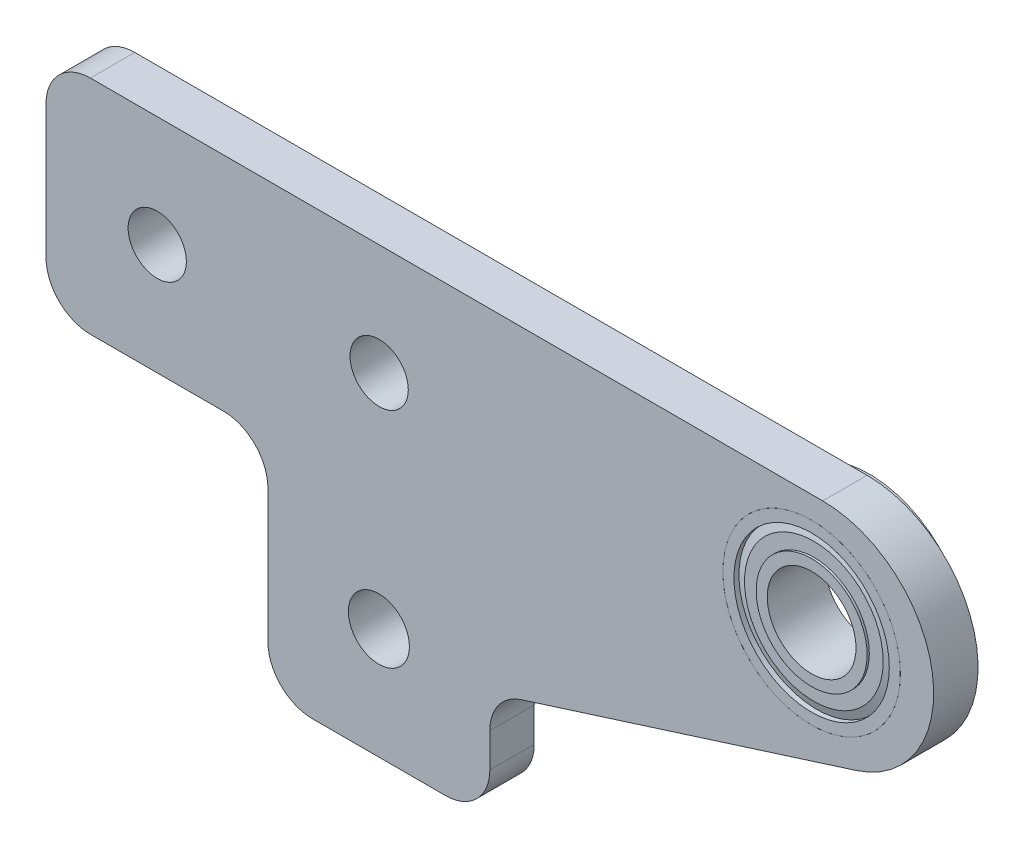
ISO-10303-21;
HEADER;
FILE_DESCRIPTION(('STEP AP214'),'2;1');
FILE_NAME('part.step','',(''),(''),'','','');
FILE_SCHEMA(('AUTOMOTIVE_DESIGN { 1 0 10303 214 1 1 1 1 }'));
ENDSEC;
DATA;
#1=APPLICATION_CONTEXT('core data for automotive mechanical design processes');
#2=APPLICATION_PROTOCOL_DEFINITION('international standard','automotive_design',2000,#1);
#3=PRODUCT_CONTEXT('',#1,'mechanical');
#4=PRODUCT('Part','Part','',(#3));
#5=PRODUCT_RELATED_PRODUCT_CATEGORY('part','',(#4));
#6=PRODUCT_DEFINITION_FORMATION('','',#4);
#7=PRODUCT_DEFINITION_CONTEXT('part definition',#1,'design');
#8=PRODUCT_DEFINITION('design','',#6,#7);
#9=PRODUCT_DEFINITION_SHAPE('','',#8);
#10=(LENGTH_UNIT() NAMED_UNIT(*) SI_UNIT(.MILLI.,.METRE.));
#11=(NAMED_UNIT(*) PLANE_ANGLE_UNIT() SI_UNIT($,.RADIAN.));
#12=(NAMED_UNIT(*) SI_UNIT($,.STERADIAN.) SOLID_ANGLE_UNIT());
#13=UNCERTAINTY_MEASURE_WITH_UNIT(LENGTH_MEASURE(1.E-05),#10,'distance_accuracy_value','');
#14=(GEOMETRIC_REPRESENTATION_CONTEXT(3) GLOBAL_UNCERTAINTY_ASSIGNED_CONTEXT((#13)) GLOBAL_UNIT_ASSIGNED_CONTEXT((#10,
#11,#12)) REPRESENTATION_CONTEXT('',''));
#15=CARTESIAN_POINT('',(0.,0.,0.));
#16=DIRECTION('',(0.,0.,1.));
#17=DIRECTION('',(1.,0.,0.));
#18=AXIS2_PLACEMENT_3D('',#15,#16,#17);
#19=CARTESIAN_POINT('',(0.,0.,-3.2));
#20=DIRECTION('',(0.,0.,1.));
#21=DIRECTION('',(1.,0.,0.));
#22=AXIS2_PLACEMENT_3D('',#19,#20,#21);
#23=CYLINDRICAL_SURFACE('',#22,9.);
#24=CARTESIAN_POINT('',(0.,0.,-3.2));
#25=DIRECTION('',(0.,0.,-1.));
#26=DIRECTION('',(-1.,0.,0.));
#27=AXIS2_PLACEMENT_3D('',#24,#25,#26);
#28=CIRCLE('',#27,9.);
#29=CARTESIAN_POINT('',(-9.,0.,-3.2));
#30=VERTEX_POINT('',#29);
#31=EDGE_CURVE('E51',#30,#30,#28,.T.);
#32=ORIENTED_EDGE('',*,*,#31,.F.);
#33=EDGE_LOOP('',(#32));
#34=FACE_BOUND('',#33,.T.);
#35=CARTESIAN_POINT('',(0.,0.,-2.));
#36=DIRECTION('',(0.,0.,-1.));
#37=DIRECTION('',(-1.,0.,0.));
#38=AXIS2_PLACEMENT_3D('',#35,#36,#37);
#39=CIRCLE('',#38,9.);
#40=CARTESIAN_POINT('',(-9.,0.,-2.));
#41=VERTEX_POINT('',#40);
#42=EDGE_CURVE('E47',#41,#41,#39,.T.);
#43=ORIENTED_EDGE('',*,*,#42,.T.);
#44=EDGE_LOOP('',(#43));
#45=FACE_BOUND('',#44,.T.);
#46=ADVANCED_FACE('F44',(#34,#45),#23,.T.);
#47=CARTESIAN_POINT('',(0.,0.,-3.2));
#48=DIRECTION('',(0.,0.,-1.));
#49=DIRECTION('',(-1.,0.,0.));
#50=AXIS2_PLACEMENT_3D('',#47,#48,#49);
#51=PLANE('',#50);
#52=CARTESIAN_POINT('',(0.,0.,-3.2));
#53=DIRECTION('',(0.,0.,1.));
#54=DIRECTION('',(1.,0.,0.));
#55=AXIS2_PLACEMENT_3D('',#52,#53,#54);
#56=CIRCLE('',#55,7.);
#57=CARTESIAN_POINT('',(7.,0.,-3.2));
#58=VERTEX_POINT('',#57);
#59=EDGE_CURVE('E81',#58,#58,#56,.T.);
#60=ORIENTED_EDGE('',*,*,#59,.T.);
#61=EDGE_LOOP('',(#60));
#62=FACE_BOUND('',#61,.T.);
#63=ORIENTED_EDGE('',*,*,#31,.T.);
#64=EDGE_LOOP('',(#63));
#65=FACE_BOUND('',#64,.T.);
#66=ADVANCED_FACE('F122',(#62,#65),#51,.T.);
#67=CARTESIAN_POINT('',(0.,0.,-2.));
#68=DIRECTION('',(0.,0.,-1.));
#69=DIRECTION('',(-1.,0.,0.));
#70=AXIS2_PLACEMENT_3D('',#67,#68,#69);
#71=PLANE('',#70);
#72=CARTESIAN_POINT('',(0.,0.,-2.));
#73=DIRECTION('',(0.,0.,1.));
#74=DIRECTION('',(1.,0.,0.));
#75=AXIS2_PLACEMENT_3D('',#72,#73,#74);
#76=CIRCLE('',#75,8.);
#77=CARTESIAN_POINT('',(-8.,0.,-2.));
#78=VERTEX_POINT('',#77);
#79=EDGE_CURVE('E11',#78,#78,#76,.T.);
#80=ORIENTED_EDGE('',*,*,#79,.F.);
#81=EDGE_LOOP('',(#80));
#82=FACE_BOUND('',#81,.T.);
#83=ORIENTED_EDGE('',*,*,#42,.F.);
#84=EDGE_LOOP('',(#83));
#85=FACE_BOUND('',#84,.T.);
#86=ADVANCED_FACE('F127',(#82,#85),#71,.F.);
#87=CARTESIAN_POINT('',(0.,0.,24.6274169979695));
#88=DIRECTION('',(0.,0.,-1.));
#89=DIRECTION('',(-1.,0.,0.));
#90=AXIS2_PLACEMENT_3D('',#87,#88,#89);
#91=CYLINDRICAL_SURFACE('',#90,8.);
#92=CARTESIAN_POINT('',(0.,0.,2.));
#93=DIRECTION('',(0.,0.,1.));
#94=DIRECTION('',(1.,0.,0.));
#95=AXIS2_PLACEMENT_3D('',#92,#93,#94);
#96=CIRCLE('',#95,8.);
#97=CARTESIAN_POINT('',(-8.,0.,2.));
#98=VERTEX_POINT('',#97);
#99=EDGE_CURVE('E60',#98,#98,#96,.T.);
#100=CARTESIAN_POINT('',(-8.,0.,-2.));
#101=CARTESIAN_POINT('',(-8.,0.,-1.95833333333333));
#102=CARTESIAN_POINT('',(-8.,0.,-1.91666666666666));
#103=CARTESIAN_POINT('',(-8.,0.,-1.83333333333333));
#104=CARTESIAN_POINT('',(-8.,0.,-1.79166666666666));
#105=CARTESIAN_POINT('',(-8.,0.,-1.70833333333333));
#106=CARTESIAN_POINT('',(-8.,0.,-1.66666666666666));
#107=CARTESIAN_POINT('',(-8.,0.,-1.58333333333333));
#108=CARTESIAN_POINT('',(-8.,0.,-1.54166666666666));
#109=CARTESIAN_POINT('',(-8.,0.,-1.45833333333333));
#110=CARTESIAN_POINT('',(-8.,0.,-1.41666666666666));
#111=CARTESIAN_POINT('',(-8.,0.,-1.33333333333333));
#112=CARTESIAN_POINT('',(-8.,0.,-1.29166666666666));
#113=CARTESIAN_POINT('',(-8.,0.,-1.20833333333333));
#114=CARTESIAN_POINT('',(-8.,0.,-1.16666666666666));
#115=CARTESIAN_POINT('',(-8.,0.,-1.08333333333333));
#116=CARTESIAN_POINT('',(-8.,0.,-1.04166666666666));
#117=CARTESIAN_POINT('',(-8.,0.,-0.958333333333332));
#118=CARTESIAN_POINT('',(-8.,0.,-0.916666666666666));
#119=CARTESIAN_POINT('',(-8.,0.,-0.833333333333334));
#120=CARTESIAN_POINT('',(-8.,0.,-0.791666666666667));
#121=CARTESIAN_POINT('',(-8.,0.,-0.708333333333334));
#122=CARTESIAN_POINT('',(-8.,0.,-0.666666666666667));
#123=CARTESIAN_POINT('',(-8.,0.,-0.583333333333334));
#124=CARTESIAN_POINT('',(-8.,0.,-0.541666666666667));
#125=CARTESIAN_POINT('',(-8.,0.,-0.458333333333334));
#126=CARTESIAN_POINT('',(-8.,0.,-0.416666666666667));
#127=CARTESIAN_POINT('',(-8.,0.,-0.333333333333334));
#128=CARTESIAN_POINT('',(-8.,0.,-0.291666666666667));
#129=CARTESIAN_POINT('',(-8.,0.,-0.208333333333334));
#130=CARTESIAN_POINT('',(-8.,0.,-0.166666666666667));
#131=CARTESIAN_POINT('',(-8.,0.,-0.0833333333333334));
#132=CARTESIAN_POINT('',(-8.,0.,-0.0416666666666667));
#133=CARTESIAN_POINT('',(-8.,0.,0.0416666666666667));
#134=CARTESIAN_POINT('',(-8.,0.,0.0833333333333334));
#135=CARTESIAN_POINT('',(-8.,0.,0.166666666666667));
#136=CARTESIAN_POINT('',(-8.,0.,0.208333333333334));
#137=CARTESIAN_POINT('',(-8.,0.,0.291666666666667));
#138=CARTESIAN_POINT('',(-8.,0.,0.333333333333334));
#139=CARTESIAN_POINT('',(-8.,0.,0.416666666666667));
#140=CARTESIAN_POINT('',(-8.,0.,0.458333333333334));
#141=CARTESIAN_POINT('',(-8.,0.,0.541666666666667));
#142=CARTESIAN_POINT('',(-8.,0.,0.583333333333334));
#143=CARTESIAN_POINT('',(-8.,0.,0.666666666666667));
#144=CARTESIAN_POINT('',(-8.,0.,0.708333333333334));
#145=CARTESIAN_POINT('',(-8.,0.,0.791666666666666));
#146=CARTESIAN_POINT('',(-8.,0.,0.833333333333332));
#147=CARTESIAN_POINT('',(-8.,0.,0.916666666666664));
#148=CARTESIAN_POINT('',(-8.,0.,0.958333333333331));
#149=CARTESIAN_POINT('',(-8.,0.,1.04166666666666));
#150=CARTESIAN_POINT('',(-8.,0.,1.08333333333333));
#151=CARTESIAN_POINT('',(-8.,0.,1.16666666666666));
#152=CARTESIAN_POINT('',(-8.,0.,1.20833333333333));
#153=CARTESIAN_POINT('',(-8.,0.,1.29166666666666));
#154=CARTESIAN_POINT('',(-8.,0.,1.33333333333333));
#155=CARTESIAN_POINT('',(-8.,0.,1.41666666666666));
#156=CARTESIAN_POINT('',(-8.,0.,1.45833333333333));
#157=CARTESIAN_POINT('',(-8.,0.,1.54166666666666));
#158=CARTESIAN_POINT('',(-8.,0.,1.58333333333333));
#159=CARTESIAN_POINT('',(-8.,0.,1.66666666666666));
#160=CARTESIAN_POINT('',(-8.,0.,1.70833333333333));
#161=CARTESIAN_POINT('',(-8.,0.,1.79166666666666));
#162=CARTESIAN_POINT('',(-8.,0.,1.83333333333333));
#163=CARTESIAN_POINT('',(-8.,0.,1.91666666666666));
#164=CARTESIAN_POINT('',(-8.,0.,1.95833333333333));
#165=CARTESIAN_POINT('',(-8.,0.,2.));
#166=B_SPLINE_CURVE_WITH_KNOTS('',3,(#100,#101,#102,#103,#104,#105,#106,#107,#108,#109,#110,
#111,#112,#113,#114,#115,#116,#117,#118,#119,#120,#121,#122,#123,#124,#125,#126,#127,#128,#129,
#130,#131,#132,#133,#134,#135,#136,#137,#138,#139,#140,#141,#142,#143,#144,#145,#146,#147,#148,
#149,#150,#151,#152,#153,#154,#155,#156,#157,#158,#159,#160,#161,#162,#163,#164,#165),
.UNSPECIFIED.,.F.,.F.,(4,2,2,2,2,2,2,2,2,2,2,2,2,2,2,2,2,2,2,2,2,2,2,2,2,2,2,2,2,2,2,2,4),(0.,
0.125,0.25,0.375,0.5,0.625000000000001,0.750000000000001,0.875000000000001,1.,1.125,1.25,1.375,
1.5,1.625,1.75,1.875,2.,2.125,2.25,2.375,2.5,2.625,2.75,2.875,3.,3.125,3.25,3.375,3.5,3.625,
3.75,3.875,4.),.UNSPECIFIED.);
#167=EDGE_CURVE('BSEAM136',#78,#98,#166,.T.);
#168=ORIENTED_EDGE('',*,*,#79,.T.);
#169=ORIENTED_EDGE('',*,*,#99,.F.);
#170=ORIENTED_EDGE('',*,*,#167,.T.);
#171=ORIENTED_EDGE('',*,*,#167,.F.);
#172=EDGE_LOOP('',(#168,#170,#169,#171));
#173=FACE_BOUND('',#172,.T.);
#174=ADVANCED_FACE('F136',(#173),#91,.T.);
#175=CARTESIAN_POINT('',(0.,0.,2.));
#176=DIRECTION('',(0.,0.,1.));
#177=DIRECTION('',(1.,0.,0.));
#178=AXIS2_PLACEMENT_3D('',#175,#176,#177);
#179=PLANE('',#178);
#180=CARTESIAN_POINT('',(0.,0.,2.));
#181=DIRECTION('',(0.,0.,1.));
#182=DIRECTION('',(1.,0.,0.));
#183=AXIS2_PLACEMENT_3D('',#180,#181,#182);
#184=CIRCLE('',#183,7.);
#185=CARTESIAN_POINT('',(7.,0.,2.));
#186=VERTEX_POINT('',#185);
#187=EDGE_CURVE('E72',#186,#186,#184,.T.);
#188=ORIENTED_EDGE('',*,*,#187,.F.);
#189=EDGE_LOOP('',(#188));
#190=FACE_BOUND('',#189,.T.);
#191=ORIENTED_EDGE('',*,*,#99,.T.);
#192=EDGE_LOOP('',(#191));
#193=FACE_BOUND('',#192,.T.);
#194=ADVANCED_FACE('F117',(#190,#193),#179,.T.);
#195=CARTESIAN_POINT('',(0.,0.,1.8));
#196=DIRECTION('',(0.,0.,1.));
#197=DIRECTION('',(1.,0.,0.));
#198=AXIS2_PLACEMENT_3D('',#195,#196,#197);
#199=CYLINDRICAL_SURFACE('',#198,7.);
#200=ORIENTED_EDGE('',*,*,#187,.T.);
#201=EDGE_LOOP('',(#200));
#202=FACE_BOUND('',#201,.T.);
#203=CARTESIAN_POINT('',(0.,0.,1.55));
#204=DIRECTION('',(0.,0.,1.));
#205=DIRECTION('',(1.,0.,0.));
#206=AXIS2_PLACEMENT_3D('',#203,#204,#205);
#207=CIRCLE('',#206,7.);
#208=CARTESIAN_POINT('',(7.,0.,1.55));
#209=VERTEX_POINT('',#208);
#210=EDGE_CURVE('E87',#209,#209,#207,.T.);
#211=ORIENTED_EDGE('',*,*,#210,.F.);
#212=EDGE_LOOP('',(#211));
#213=FACE_BOUND('',#212,.T.);
#214=ADVANCED_FACE('F143',(#202,#213),#199,.F.);
#215=CARTESIAN_POINT('',(0.,0.,-3.));
#216=DIRECTION('',(0.,0.,-1.));
#217=DIRECTION('',(-1.,0.,0.));
#218=AXIS2_PLACEMENT_3D('',#215,#216,#217);
#219=CYLINDRICAL_SURFACE('',#218,7.);
#220=ORIENTED_EDGE('',*,*,#59,.F.);
#221=EDGE_LOOP('',(#220));
#222=FACE_BOUND('',#221,.T.);
#223=CARTESIAN_POINT('',(0.,0.,-2.74999999999998));
#224=DIRECTION('',(0.,0.,1.));
#225=DIRECTION('',(1.,0.,0.));
#226=AXIS2_PLACEMENT_3D('',#223,#224,#225);
#227=CIRCLE('',#226,7.);
#228=CARTESIAN_POINT('',(7.,0.,-2.74999999999998));
#229=VERTEX_POINT('',#228);
#230=EDGE_CURVE('E90',#229,#229,#227,.T.);
#231=ORIENTED_EDGE('',*,*,#230,.T.);
#232=EDGE_LOOP('',(#231));
#233=FACE_BOUND('',#232,.T.);
#234=ADVANCED_FACE('F118',(#222,#233),#219,.F.);
#235=CARTESIAN_POINT('',(0.,0.,-2.74999999999998));
#236=DIRECTION('',(0.,0.,1.));
#237=DIRECTION('',(1.,0.,0.));
#238=AXIS2_PLACEMENT_3D('',#235,#236,#237);
#239=CONICAL_SURFACE('',#238,7.,1.24904577239826);
#240=CARTESIAN_POINT('',(0.,0.,-2.99999999999998));
#241=DIRECTION('',(0.,0.,1.));
#242=DIRECTION('',(1.,0.,0.));
#243=AXIS2_PLACEMENT_3D('',#240,#241,#242);
#244=CIRCLE('',#243,6.25);
#245=CARTESIAN_POINT('',(6.25,0.,-2.99999999999998));
#246=VERTEX_POINT('',#245);
#247=EDGE_CURVE('E94',#246,#246,#244,.T.);
#248=ORIENTED_EDGE('',*,*,#247,.T.);
#249=EDGE_LOOP('',(#248));
#250=FACE_BOUND('',#249,.T.);
#251=ORIENTED_EDGE('',*,*,#230,.F.);
#252=EDGE_LOOP('',(#251));
#253=FACE_BOUND('',#252,.T.);
#254=ADVANCED_FACE('F107',(#250,#253),#239,.T.);
#255=CARTESIAN_POINT('',(0.,0.,1.8));
#256=DIRECTION('',(0.,0.,-1.));
#257=DIRECTION('',(-1.,0.,0.));
#258=AXIS2_PLACEMENT_3D('',#255,#256,#257);
#259=CONICAL_SURFACE('',#258,6.25,1.24904577239825);
#260=ORIENTED_EDGE('',*,*,#210,.T.);
#261=EDGE_LOOP('',(#260));
#262=FACE_BOUND('',#261,.T.);
#263=CARTESIAN_POINT('',(0.,0.,1.8));
#264=DIRECTION('',(0.,0.,1.));
#265=DIRECTION('',(1.,0.,0.));
#266=AXIS2_PLACEMENT_3D('',#263,#264,#265);
#267=CIRCLE('',#266,6.25);
#268=CARTESIAN_POINT('',(6.25,0.,1.8));
#269=VERTEX_POINT('',#268);
#270=EDGE_CURVE('E93',#269,#269,#267,.T.);
#271=ORIENTED_EDGE('',*,*,#270,.F.);
#272=EDGE_LOOP('',(#271));
#273=FACE_BOUND('',#272,.T.);
#274=ADVANCED_FACE('F104',(#262,#273),#259,.T.);
#275=CARTESIAN_POINT('',(0.,0.,2.));
#276=DIRECTION('',(0.,0.,1.));
#277=DIRECTION('',(1.,0.,0.));
#278=AXIS2_PLACEMENT_3D('',#275,#276,#277);
#279=CIRCLE('',#278,4.);
#280=CARTESIAN_POINT('',(4.,0.,2.));
#281=VERTEX_POINT('',#280);
#282=EDGE_CURVE('E58',#281,#281,#279,.T.);
#283=ORIENTED_EDGE('',*,*,#282,.F.);
#284=EDGE_LOOP('',(#283));
#285=FACE_BOUND('',#284,.T.);
#286=CARTESIAN_POINT('',(0.,0.,2.));
#287=DIRECTION('',(0.,0.,1.));
#288=DIRECTION('',(1.,0.,0.));
#289=AXIS2_PLACEMENT_3D('',#286,#287,#288);
#290=CIRCLE('',#289,5.);
#291=CARTESIAN_POINT('',(5.,0.,2.));
#292=VERTEX_POINT('',#291);
#293=EDGE_CURVE('E75',#292,#292,#290,.T.);
#294=ORIENTED_EDGE('',*,*,#293,.T.);
#295=EDGE_LOOP('',(#294));
#296=FACE_BOUND('',#295,.T.);
#297=ADVANCED_FACE('F106',(#285,#296),#179,.T.);
#298=CARTESIAN_POINT('',(0.,0.,1.8));
#299=DIRECTION('',(0.,0.,1.));
#300=DIRECTION('',(1.,0.,0.));
#301=AXIS2_PLACEMENT_3D('',#298,#299,#300);
#302=CYLINDRICAL_SURFACE('',#301,5.);
#303=CARTESIAN_POINT('',(0.,0.,1.8));
#304=DIRECTION('',(0.,0.,1.));
#305=DIRECTION('',(1.,0.,0.));
#306=AXIS2_PLACEMENT_3D('',#303,#304,#305);
#307=CIRCLE('',#306,5.);
#308=CARTESIAN_POINT('',(5.,0.,1.8));
#309=VERTEX_POINT('',#308);
#310=EDGE_CURVE('E70',#309,#309,#307,.T.);
#311=ORIENTED_EDGE('',*,*,#310,.T.);
#312=EDGE_LOOP('',(#311));
#313=FACE_BOUND('',#312,.T.);
#314=ORIENTED_EDGE('',*,*,#293,.F.);
#315=EDGE_LOOP('',(#314));
#316=FACE_BOUND('',#315,.T.);
#317=ADVANCED_FACE('F114',(#313,#316),#302,.T.);
#318=CARTESIAN_POINT('',(0.,0.,1.8));
#319=DIRECTION('',(0.,0.,1.));
#320=DIRECTION('',(1.,0.,0.));
#321=AXIS2_PLACEMENT_3D('',#318,#319,#320);
#322=PLANE('',#321);
#323=ORIENTED_EDGE('',*,*,#310,.F.);
#324=EDGE_LOOP('',(#323));
#325=FACE_BOUND('',#324,.T.);
#326=ORIENTED_EDGE('',*,*,#270,.T.);
#327=EDGE_LOOP('',(#326));
#328=FACE_BOUND('',#327,.T.);
#329=ADVANCED_FACE('F102',(#325,#328),#322,.T.);
#330=CARTESIAN_POINT('',(0.,0.,-3.2));
#331=DIRECTION('',(0.,0.,1.));
#332=DIRECTION('',(1.,0.,0.));
#333=AXIS2_PLACEMENT_3D('',#330,#331,#332);
#334=CYLINDRICAL_SURFACE('',#333,4.);
#335=CARTESIAN_POINT('',(0.,0.,-3.2));
#336=DIRECTION('',(0.,0.,1.));
#337=DIRECTION('',(1.,0.,0.));
#338=AXIS2_PLACEMENT_3D('',#335,#336,#337);
#339=CIRCLE('',#338,4.);
#340=CARTESIAN_POINT('',(4.,0.,-3.2));
#341=VERTEX_POINT('',#340);
#342=EDGE_CURVE('E62',#341,#341,#339,.T.);
#343=ORIENTED_EDGE('',*,*,#342,.F.);
#344=EDGE_LOOP('',(#343));
#345=FACE_BOUND('',#344,.T.);
#346=ORIENTED_EDGE('',*,*,#282,.T.);
#347=EDGE_LOOP('',(#346));
#348=FACE_BOUND('',#347,.T.);
#349=ADVANCED_FACE('F146',(#345,#348),#334,.F.);
#350=ORIENTED_EDGE('',*,*,#342,.T.);
#351=EDGE_LOOP('',(#350));
#352=FACE_BOUND('',#351,.T.);
#353=CARTESIAN_POINT('',(0.,0.,-3.2));
#354=DIRECTION('',(0.,0.,1.));
#355=DIRECTION('',(1.,0.,0.));
#356=AXIS2_PLACEMENT_3D('',#353,#354,#355);
#357=CIRCLE('',#356,5.);
#358=CARTESIAN_POINT('',(5.,0.,-3.2));
#359=VERTEX_POINT('',#358);
#360=EDGE_CURVE('E84',#359,#359,#357,.T.);
#361=ORIENTED_EDGE('',*,*,#360,.F.);
#362=EDGE_LOOP('',(#361));
#363=FACE_BOUND('',#362,.T.);
#364=ADVANCED_FACE('F130',(#352,#363),#51,.T.);
#365=CARTESIAN_POINT('',(0.,0.,-3.));
#366=DIRECTION('',(0.,0.,-1.));
#367=DIRECTION('',(-1.,0.,0.));
#368=AXIS2_PLACEMENT_3D('',#365,#366,#367);
#369=CYLINDRICAL_SURFACE('',#368,5.);
#370=CARTESIAN_POINT('',(0.,0.,-3.));
#371=DIRECTION('',(0.,0.,1.));
#372=DIRECTION('',(1.,0.,0.));
#373=AXIS2_PLACEMENT_3D('',#370,#371,#372);
#374=CIRCLE('',#373,5.);
#375=CARTESIAN_POINT('',(5.,0.,-3.));
#376=VERTEX_POINT('',#375);
#377=EDGE_CURVE('E78',#376,#376,#374,.T.);
#378=ORIENTED_EDGE('',*,*,#377,.F.);
#379=EDGE_LOOP('',(#378));
#380=FACE_BOUND('',#379,.T.);
#381=ORIENTED_EDGE('',*,*,#360,.T.);
#382=EDGE_LOOP('',(#381));
#383=FACE_BOUND('',#382,.T.);
#384=ADVANCED_FACE('F159',(#380,#383),#369,.T.);
#385=CARTESIAN_POINT('',(0.,0.,-3.));
#386=DIRECTION('',(0.,0.,-1.));
#387=DIRECTION('',(1.,0.,0.));
#388=AXIS2_PLACEMENT_3D('',#385,#386,#387);
#389=PLANE('',#388);
#390=ORIENTED_EDGE('',*,*,#377,.T.);
#391=EDGE_LOOP('',(#390));
#392=FACE_BOUND('',#391,.T.);
#393=ORIENTED_EDGE('',*,*,#247,.F.);
#394=EDGE_LOOP('',(#393));
#395=FACE_BOUND('',#394,.T.);
#396=ADVANCED_FACE('F162',(#392,#395),#389,.T.);
#397=CLOSED_SHELL('',(#46,#66,#86,#174,#194,#214,#234,#254,#274,#297,#317,#329,#349,#364,#384,#396));
#398=MANIFOLD_SOLID_BREP('B2',#397);
#399=CARTESIAN_POINT('',(3.11300118671103,-9.82058651969251,2.));
#400=DIRECTION('',(-0.302169479251962,0.953254218877943,0.));
#401=DIRECTION('',(-0.953254218877943,-0.302169479251963,0.));
#402=AXIS2_PLACEMENT_3D('',#399,#400,#401);
#403=PLANE('',#402);
#404=DIRECTION('',(0.953254218877943,0.302169479251963,0.));
#405=VECTOR('',#404,1.);
#406=CARTESIAN_POINT('',(3.11300118671103,-9.82058651969251,2.));
#407=LINE('',#406,#405);
#408=CARTESIAN_POINT('',(-26.2086779170079,-19.1151863547638,2.));
#409=VERTEX_POINT('',#408);
#410=CARTESIAN_POINT('',(4.02169479251962,-9.53254218877943,2.));
#411=VERTEX_POINT('',#410);
#412=EDGE_CURVE('E388',#409,#411,#407,.T.);
#413=ORIENTED_EDGE('',*,*,#412,.F.);
#414=DIRECTION('',(0.,0.,-1.));
#415=VECTOR('',#414,1.);
#416=CARTESIAN_POINT('',(-26.2086779170079,-19.1151863547637,-2.));
#417=LINE('',#416,#415);
#418=CARTESIAN_POINT('',(-26.2086779170079,-19.1151863547638,-2.));
#419=VERTEX_POINT('',#418);
#420=EDGE_CURVE('E417',#409,#419,#417,.T.);
#421=ORIENTED_EDGE('',*,*,#420,.T.);
#422=DIRECTION('',(0.953254218877943,0.302169479251963,0.));
#423=VECTOR('',#422,1.);
#424=CARTESIAN_POINT('',(3.11300118671103,-9.82058651969251,-2.));
#425=LINE('',#424,#423);
#426=CARTESIAN_POINT('',(4.02169479251962,-9.53254218877943,-2.));
#427=VERTEX_POINT('',#426);
#428=EDGE_CURVE('E415',#419,#427,#425,.T.);
#429=ORIENTED_EDGE('',*,*,#428,.T.);
#430=DIRECTION('',(0.,0.,-1.));
#431=VECTOR('',#430,1.);
#432=CARTESIAN_POINT('',(4.02169479251962,-9.53254218877943,2.));
#433=LINE('',#432,#431);
#434=EDGE_CURVE('E408',#411,#427,#433,.T.);
#435=ORIENTED_EDGE('',*,*,#434,.F.);
#436=EDGE_LOOP('',(#413,#421,#429,#435));
#437=FACE_BOUND('',#436,.T.);
#438=ADVANCED_FACE('F289',(#437),#403,.F.);
#439=CARTESIAN_POINT('',(1.,0.,2.));
#440=DIRECTION('',(0.,0.,-1.));
#441=DIRECTION('',(-1.,0.,0.));
#442=AXIS2_PLACEMENT_3D('',#439,#440,#441);
#443=CYLINDRICAL_SURFACE('',#442,10.);
#444=CARTESIAN_POINT('',(1.,0.,-2.));
#445=DIRECTION('',(0.,0.,1.));
#446=DIRECTION('',(1.,0.,0.));
#447=AXIS2_PLACEMENT_3D('',#444,#445,#446);
#448=CIRCLE('',#447,10.);
#449=CARTESIAN_POINT('',(0.999999999999999,10.,-2.));
#450=VERTEX_POINT('',#449);
#451=EDGE_CURVE('E503',#427,#450,#448,.T.);
#452=ORIENTED_EDGE('',*,*,#451,.T.);
#453=DIRECTION('',(0.,0.,-1.));
#454=VECTOR('',#453,1.);
#455=CARTESIAN_POINT('',(0.999999999999999,10.,2.));
#456=LINE('',#455,#454);
#457=CARTESIAN_POINT('',(0.999999999999999,10.,2.));
#458=VERTEX_POINT('',#457);
#459=EDGE_CURVE('E410',#458,#450,#456,.T.);
#460=ORIENTED_EDGE('',*,*,#459,.F.);
#461=CARTESIAN_POINT('',(1.,0.,2.));
#462=DIRECTION('',(0.,0.,1.));
#463=DIRECTION('',(1.,0.,0.));
#464=AXIS2_PLACEMENT_3D('',#461,#462,#463);
#465=CIRCLE('',#464,10.);
#466=EDGE_CURVE('E394',#411,#458,#465,.T.);
#467=ORIENTED_EDGE('',*,*,#466,.F.);
#468=ORIENTED_EDGE('',*,*,#434,.T.);
#469=EDGE_LOOP('',(#452,#460,#467,#468));
#470=FACE_BOUND('',#469,.T.);
#471=ADVANCED_FACE('F407',(#470),#443,.T.);
#472=CARTESIAN_POINT('',(0.,10.,2.));
#473=DIRECTION('',(0.,-1.,0.));
#474=DIRECTION('',(1.,0.,0.));
#475=AXIS2_PLACEMENT_3D('',#472,#473,#474);
#476=PLANE('',#475);
#477=DIRECTION('',(-1.,0.,0.));
#478=VECTOR('',#477,1.);
#479=CARTESIAN_POINT('',(0.,10.,-2.));
#480=LINE('',#479,#478);
#481=CARTESIAN_POINT('',(-65.,9.99999999999999,-2.));
#482=VERTEX_POINT('',#481);
#483=EDGE_CURVE('E506',#450,#482,#480,.T.);
#484=ORIENTED_EDGE('',*,*,#483,.T.);
#485=DIRECTION('',(0.,0.,-1.));
#486=VECTOR('',#485,1.);
#487=CARTESIAN_POINT('',(-65.,9.99999999999999,2.));
#488=LINE('',#487,#486);
#489=CARTESIAN_POINT('',(-65.,9.99999999999999,2.));
#490=VERTEX_POINT('',#489);
#491=EDGE_CURVE('E464',#482,#490,#488,.F.);
#492=ORIENTED_EDGE('',*,*,#491,.T.);
#493=DIRECTION('',(-1.,0.,0.));
#494=VECTOR('',#493,1.);
#495=CARTESIAN_POINT('',(0.,10.,2.));
#496=LINE('',#495,#494);
#497=EDGE_CURVE('E412',#458,#490,#496,.T.);
#498=ORIENTED_EDGE('',*,*,#497,.F.);
#499=ORIENTED_EDGE('',*,*,#459,.T.);
#500=EDGE_LOOP('',(#484,#492,#498,#499));
#501=FACE_BOUND('',#500,.T.);
#502=ADVANCED_FACE('F540',(#501),#476,.F.);
#503=CARTESIAN_POINT('',(-69.,0.,2.));
#504=DIRECTION('',(1.,0.,0.));
#505=DIRECTION('',(0.,1.,0.));
#506=AXIS2_PLACEMENT_3D('',#503,#504,#505);
#507=PLANE('',#506);
#508=DIRECTION('',(0.,-1.,0.));
#509=VECTOR('',#508,1.);
#510=CARTESIAN_POINT('',(-69.,0.,-2.));
#511=LINE('',#510,#509);
#512=CARTESIAN_POINT('',(-69.,5.99999999999999,-2.));
#513=VERTEX_POINT('',#512);
#514=CARTESIAN_POINT('',(-69.,-6.00000000000001,-2.));
#515=VERTEX_POINT('',#514);
#516=EDGE_CURVE('E484',#513,#515,#511,.T.);
#517=ORIENTED_EDGE('',*,*,#516,.T.);
#518=DIRECTION('',(0.,0.,-1.));
#519=VECTOR('',#518,1.);
#520=CARTESIAN_POINT('',(-69.,-6.00000000000001,2.));
#521=LINE('',#520,#519);
#522=CARTESIAN_POINT('',(-69.,-6.00000000000001,2.));
#523=VERTEX_POINT('',#522);
#524=EDGE_CURVE('E462',#515,#523,#521,.F.);
#525=ORIENTED_EDGE('',*,*,#524,.T.);
#526=DIRECTION('',(0.,-1.,0.));
#527=VECTOR('',#526,1.);
#528=CARTESIAN_POINT('',(-69.,0.,2.));
#529=LINE('',#528,#527);
#530=CARTESIAN_POINT('',(-69.,5.99999999999999,2.));
#531=VERTEX_POINT('',#530);
#532=EDGE_CURVE('E495',#531,#523,#529,.T.);
#533=ORIENTED_EDGE('',*,*,#532,.F.);
#534=DIRECTION('',(0.,0.,-1.));
#535=VECTOR('',#534,1.);
#536=CARTESIAN_POINT('',(-69.,5.99999999999999,2.));
#537=LINE('',#536,#535);
#538=EDGE_CURVE('E459',#531,#513,#537,.T.);
#539=ORIENTED_EDGE('',*,*,#538,.T.);
#540=EDGE_LOOP('',(#517,#525,#533,#539));
#541=FACE_BOUND('',#540,.T.);
#542=ADVANCED_FACE('F658',(#541),#507,.F.);
#543=CARTESIAN_POINT('',(0.,-10.,2.));
#544=DIRECTION('',(0.,1.,0.));
#545=DIRECTION('',(-1.,0.,0.));
#546=AXIS2_PLACEMENT_3D('',#543,#544,#545);
#547=PLANE('',#546);
#548=DIRECTION('',(1.,0.,0.));
#549=VECTOR('',#548,1.);
#550=CARTESIAN_POINT('',(0.,-10.,-2.));
#551=LINE('',#550,#549);
#552=CARTESIAN_POINT('',(-65.,-10.,-2.));
#553=VERTEX_POINT('',#552);
#554=CARTESIAN_POINT('',(-53.,-10.,-2.));
#555=VERTEX_POINT('',#554);
#556=EDGE_CURVE('E475',#553,#555,#551,.T.);
#557=ORIENTED_EDGE('',*,*,#556,.T.);
#558=DIRECTION('',(0.,0.,-1.));
#559=VECTOR('',#558,1.);
#560=CARTESIAN_POINT('',(-53.,-10.,2.));
#561=LINE('',#560,#559);
#562=CARTESIAN_POINT('',(-53.,-10.,2.));
#563=VERTEX_POINT('',#562);
#564=EDGE_CURVE('E457',#555,#563,#561,.F.);
#565=ORIENTED_EDGE('',*,*,#564,.T.);
#566=DIRECTION('',(1.,0.,0.));
#567=VECTOR('',#566,1.);
#568=CARTESIAN_POINT('',(0.,-10.,2.));
#569=LINE('',#568,#567);
#570=CARTESIAN_POINT('',(-65.,-10.,2.));
#571=VERTEX_POINT('',#570);
#572=EDGE_CURVE('E491',#571,#563,#569,.T.);
#573=ORIENTED_EDGE('',*,*,#572,.F.);
#574=DIRECTION('',(0.,0.,-1.));
#575=VECTOR('',#574,1.);
#576=CARTESIAN_POINT('',(-65.,-10.,2.));
#577=LINE('',#576,#575);
#578=EDGE_CURVE('E454',#571,#553,#577,.T.);
#579=ORIENTED_EDGE('',*,*,#578,.T.);
#580=EDGE_LOOP('',(#557,#565,#573,#579));
#581=FACE_BOUND('',#580,.T.);
#582=ADVANCED_FACE('F481',(#581),#547,.F.);
#583=CARTESIAN_POINT('',(-49.,0.,2.));
#584=DIRECTION('',(1.,0.,0.));
#585=DIRECTION('',(0.,0.,-1.));
#586=AXIS2_PLACEMENT_3D('',#583,#584,#585);
#587=PLANE('',#586);
#588=DIRECTION('',(0.,-1.,0.));
#589=VECTOR('',#588,1.);
#590=CARTESIAN_POINT('',(-49.,0.,-2.));
#591=LINE('',#590,#589);
#592=CARTESIAN_POINT('',(-49.,-14.,-2.));
#593=VERTEX_POINT('',#592);
#594=CARTESIAN_POINT('',(-49.,-26.,-2.));
#595=VERTEX_POINT('',#594);
#596=EDGE_CURVE('E476',#593,#595,#591,.T.);
#597=ORIENTED_EDGE('',*,*,#596,.T.);
#598=DIRECTION('',(0.,0.,-1.));
#599=VECTOR('',#598,1.);
#600=CARTESIAN_POINT('',(-49.,-26.,2.));
#601=LINE('',#600,#599);
#602=CARTESIAN_POINT('',(-49.,-26.,2.));
#603=VERTEX_POINT('',#602);
#604=EDGE_CURVE('E304',#595,#603,#601,.F.);
#605=ORIENTED_EDGE('',*,*,#604,.T.);
#606=DIRECTION('',(0.,-1.,0.));
#607=VECTOR('',#606,1.);
#608=CARTESIAN_POINT('',(-49.,0.,2.));
#609=LINE('',#608,#607);
#610=CARTESIAN_POINT('',(-49.,-14.,2.));
#611=VERTEX_POINT('',#610);
#612=EDGE_CURVE('E488',#611,#603,#609,.T.);
#613=ORIENTED_EDGE('',*,*,#612,.F.);
#614=DIRECTION('',(0.,0.,-1.));
#615=VECTOR('',#614,1.);
#616=CARTESIAN_POINT('',(-49.,-14.,-2.));
#617=LINE('',#616,#615);
#618=EDGE_CURVE('E450',#611,#593,#617,.T.);
#619=ORIENTED_EDGE('',*,*,#618,.T.);
#620=EDGE_LOOP('',(#597,#605,#613,#619));
#621=FACE_BOUND('',#620,.T.);
#622=ADVANCED_FACE('F487',(#621),#587,.F.);
#623=CARTESIAN_POINT('',(0.,-30.,2.));
#624=DIRECTION('',(0.,1.,0.));
#625=DIRECTION('',(-1.,0.,0.));
#626=AXIS2_PLACEMENT_3D('',#623,#624,#625);
#627=PLANE('',#626);
#628=DIRECTION('',(1.,0.,0.));
#629=VECTOR('',#628,1.);
#630=CARTESIAN_POINT('',(0.,-30.,-2.));
#631=LINE('',#630,#629);
#632=CARTESIAN_POINT('',(-45.,-30.,-2.));
#633=VERTEX_POINT('',#632);
#634=CARTESIAN_POINT('',(-33.,-30.,-2.));
#635=VERTEX_POINT('',#634);
#636=EDGE_CURVE('E512',#633,#635,#631,.T.);
#637=ORIENTED_EDGE('',*,*,#636,.T.);
#638=DIRECTION('',(0.,0.,-1.));
#639=VECTOR('',#638,1.);
#640=CARTESIAN_POINT('',(-33.,-30.,2.));
#641=LINE('',#640,#639);
#642=CARTESIAN_POINT('',(-33.,-30.,2.));
#643=VERTEX_POINT('',#642);
#644=EDGE_CURVE('E440',#635,#643,#641,.F.);
#645=ORIENTED_EDGE('',*,*,#644,.T.);
#646=DIRECTION('',(1.,0.,0.));
#647=VECTOR('',#646,1.);
#648=CARTESIAN_POINT('',(0.,-30.,2.));
#649=LINE('',#648,#647);
#650=CARTESIAN_POINT('',(-45.,-30.,2.));
#651=VERTEX_POINT('',#650);
#652=EDGE_CURVE('E490',#651,#643,#649,.T.);
#653=ORIENTED_EDGE('',*,*,#652,.F.);
#654=DIRECTION('',(0.,0.,-1.));
#655=VECTOR('',#654,1.);
#656=CARTESIAN_POINT('',(-45.,-30.,2.));
#657=LINE('',#656,#655);
#658=EDGE_CURVE('E437',#651,#633,#657,.T.);
#659=ORIENTED_EDGE('',*,*,#658,.T.);
#660=EDGE_LOOP('',(#637,#645,#653,#659));
#661=FACE_BOUND('',#660,.T.);
#662=ADVANCED_FACE('F531',(#661),#627,.F.);
#663=CARTESIAN_POINT('',(-29.,0.,2.));
#664=DIRECTION('',(-1.,0.,0.));
#665=DIRECTION('',(0.,0.,1.));
#666=AXIS2_PLACEMENT_3D('',#663,#664,#665);
#667=PLANE('',#666);
#668=DIRECTION('',(0.,1.,0.));
#669=VECTOR('',#668,1.);
#670=CARTESIAN_POINT('',(-29.,0.,-2.));
#671=LINE('',#670,#669);
#672=CARTESIAN_POINT('',(-29.,-26.,-2.));
#673=VERTEX_POINT('',#672);
#674=CARTESIAN_POINT('',(-29.,-22.9282032302755,-2.));
#675=VERTEX_POINT('',#674);
#676=EDGE_CURVE('E515',#673,#675,#671,.T.);
#677=ORIENTED_EDGE('',*,*,#676,.T.);
#678=DIRECTION('',(0.,0.,-1.));
#679=VECTOR('',#678,1.);
#680=CARTESIAN_POINT('',(-29.,-22.9282032302755,2.));
#681=LINE('',#680,#679);
#682=CARTESIAN_POINT('',(-29.,-22.9282032302755,2.));
#683=VERTEX_POINT('',#682);
#684=EDGE_CURVE('E427',#675,#683,#681,.F.);
#685=ORIENTED_EDGE('',*,*,#684,.T.);
#686=DIRECTION('',(0.,1.,0.));
#687=VECTOR('',#686,1.);
#688=CARTESIAN_POINT('',(-29.,0.,2.));
#689=LINE('',#688,#687);
#690=CARTESIAN_POINT('',(-29.,-26.,2.));
#691=VERTEX_POINT('',#690);
#692=EDGE_CURVE('E493',#691,#683,#689,.T.);
#693=ORIENTED_EDGE('',*,*,#692,.F.);
#694=DIRECTION('',(0.,0.,-1.));
#695=VECTOR('',#694,1.);
#696=CARTESIAN_POINT('',(-29.,-26.,2.));
#697=LINE('',#696,#695);
#698=EDGE_CURVE('E419',#691,#673,#697,.T.);
#699=ORIENTED_EDGE('',*,*,#698,.T.);
#700=EDGE_LOOP('',(#677,#685,#693,#699));
#701=FACE_BOUND('',#700,.T.);
#702=ADVANCED_FACE('F522',(#701),#667,.F.);
#703=CARTESIAN_POINT('',(0.,0.,2.));
#704=DIRECTION('',(0.,0.,-1.));
#705=DIRECTION('',(-1.,0.,0.));
#706=AXIS2_PLACEMENT_3D('',#703,#704,#705);
#707=CYLINDRICAL_SURFACE('',#706,8.);
#708=CARTESIAN_POINT('',(0.,0.,2.));
#709=DIRECTION('',(0.,0.,1.));
#710=DIRECTION('',(1.,0.,0.));
#711=AXIS2_PLACEMENT_3D('',#708,#709,#710);
#712=CIRCLE('',#711,8.);
#713=CARTESIAN_POINT('',(8.,0.,2.));
#714=VERTEX_POINT('',#713);
#715=EDGE_CURVE('E421',#714,#714,#712,.T.);
#716=ORIENTED_EDGE('',*,*,#715,.T.);
#717=EDGE_LOOP('',(#716));
#718=FACE_BOUND('',#717,.T.);
#719=CARTESIAN_POINT('',(0.,0.,-2.));
#720=DIRECTION('',(0.,0.,1.));
#721=DIRECTION('',(1.,0.,0.));
#722=AXIS2_PLACEMENT_3D('',#719,#720,#721);
#723=CIRCLE('',#722,8.);
#724=CARTESIAN_POINT('',(8.,0.,-2.));
#725=VERTEX_POINT('',#724);
#726=EDGE_CURVE('E403',#725,#725,#723,.T.);
#727=ORIENTED_EDGE('',*,*,#726,.F.);
#728=EDGE_LOOP('',(#727));
#729=FACE_BOUND('',#728,.T.);
#730=ADVANCED_FACE('F520',(#718,#729),#707,.F.);
#731=CARTESIAN_POINT('',(0.,0.,2.));
#732=DIRECTION('',(0.,0.,1.));
#733=DIRECTION('',(1.,0.,0.));
#734=AXIS2_PLACEMENT_3D('',#731,#732,#733);
#735=PLANE('',#734);
#736=CARTESIAN_POINT('',(-39.,-20.,2.));
#737=DIRECTION('',(0.,0.,1.));
#738=DIRECTION('',(1.,0.,0.));
#739=AXIS2_PLACEMENT_3D('',#736,#737,#738);
#740=CIRCLE('',#739,2.75);
#741=CARTESIAN_POINT('',(-36.25,-20.,2.));
#742=VERTEX_POINT('',#741);
#743=EDGE_CURVE('E586',#742,#742,#740,.T.);
#744=ORIENTED_EDGE('',*,*,#743,.F.);
#745=EDGE_LOOP('',(#744));
#746=FACE_BOUND('',#745,.T.);
#747=CARTESIAN_POINT('',(-58.975,0.,2.));
#748=DIRECTION('',(0.,0.,1.));
#749=DIRECTION('',(1.,0.,0.));
#750=AXIS2_PLACEMENT_3D('',#747,#748,#749);
#751=CIRCLE('',#750,2.625);
#752=CARTESIAN_POINT('',(-56.35,0.,2.));
#753=VERTEX_POINT('',#752);
#754=EDGE_CURVE('E580',#753,#753,#751,.T.);
#755=ORIENTED_EDGE('',*,*,#754,.F.);
#756=EDGE_LOOP('',(#755));
#757=FACE_BOUND('',#756,.T.);
#758=CARTESIAN_POINT('',(-38.975,0.,2.));
#759=DIRECTION('',(0.,0.,1.));
#760=DIRECTION('',(1.,0.,0.));
#761=AXIS2_PLACEMENT_3D('',#758,#759,#760);
#762=CIRCLE('',#761,2.625);
#763=CARTESIAN_POINT('',(-36.35,0.,2.));
#764=VERTEX_POINT('',#763);
#765=EDGE_CURVE('E574',#764,#764,#762,.T.);
#766=ORIENTED_EDGE('',*,*,#765,.F.);
#767=EDGE_LOOP('',(#766));
#768=FACE_BOUND('',#767,.T.);
#769=ORIENTED_EDGE('',*,*,#652,.T.);
#770=CARTESIAN_POINT('',(-33.,-26.,2.));
#771=DIRECTION('',(0.,0.,1.));
#772=DIRECTION('',(1.,0.,0.));
#773=AXIS2_PLACEMENT_3D('',#770,#771,#772);
#774=CIRCLE('',#773,4.);
#775=EDGE_CURVE('E448',#643,#691,#774,.T.);
#776=ORIENTED_EDGE('',*,*,#775,.T.);
#777=ORIENTED_EDGE('',*,*,#692,.T.);
#778=CARTESIAN_POINT('',(-25.,-22.9282032302755,2.));
#779=DIRECTION('',(0.,0.,1.));
#780=DIRECTION('',(1.,0.,0.));
#781=AXIS2_PLACEMENT_3D('',#778,#779,#780);
#782=CIRCLE('',#781,4.);
#783=EDGE_CURVE('E398',#683,#409,#782,.F.);
#784=ORIENTED_EDGE('',*,*,#783,.T.);
#785=ORIENTED_EDGE('',*,*,#412,.T.);
#786=ORIENTED_EDGE('',*,*,#466,.T.);
#787=ORIENTED_EDGE('',*,*,#497,.T.);
#788=CARTESIAN_POINT('',(-65.,5.99999999999999,2.));
#789=DIRECTION('',(0.,0.,1.));
#790=DIRECTION('',(1.,0.,0.));
#791=AXIS2_PLACEMENT_3D('',#788,#789,#790);
#792=CIRCLE('',#791,4.);
#793=EDGE_CURVE('E442',#490,#531,#792,.T.);
#794=ORIENTED_EDGE('',*,*,#793,.T.);
#795=ORIENTED_EDGE('',*,*,#532,.T.);
#796=CARTESIAN_POINT('',(-65.,-6.00000000000001,2.));
#797=DIRECTION('',(0.,0.,1.));
#798=DIRECTION('',(1.,0.,0.));
#799=AXIS2_PLACEMENT_3D('',#796,#797,#798);
#800=CIRCLE('',#799,4.);
#801=EDGE_CURVE('E444',#523,#571,#800,.T.);
#802=ORIENTED_EDGE('',*,*,#801,.T.);
#803=ORIENTED_EDGE('',*,*,#572,.T.);
#804=CARTESIAN_POINT('',(-53.,-14.,2.));
#805=DIRECTION('',(0.,0.,1.));
#806=DIRECTION('',(1.,0.,0.));
#807=AXIS2_PLACEMENT_3D('',#804,#805,#806);
#808=CIRCLE('',#807,4.);
#809=EDGE_CURVE('E42',#563,#611,#808,.F.);
#810=ORIENTED_EDGE('',*,*,#809,.T.);
#811=ORIENTED_EDGE('',*,*,#612,.T.);
#812=CARTESIAN_POINT('',(-45.,-26.,2.));
#813=DIRECTION('',(0.,0.,1.));
#814=DIRECTION('',(1.,0.,0.));
#815=AXIS2_PLACEMENT_3D('',#812,#813,#814);
#816=CIRCLE('',#815,4.);
#817=EDGE_CURVE('E446',#603,#651,#816,.T.);
#818=ORIENTED_EDGE('',*,*,#817,.T.);
#819=EDGE_LOOP('',(#769,#776,#777,#784,#785,#786,#787,#794,#795,#802,#803,#810,#811,#818));
#820=FACE_BOUND('',#819,.T.);
#821=ORIENTED_EDGE('',*,*,#715,.F.);
#822=EDGE_LOOP('',(#821));
#823=FACE_BOUND('',#822,.T.);
#824=ADVANCED_FACE('F391',(#746,#757,#768,#820,#823),#735,.T.);
#825=CARTESIAN_POINT('',(0.,0.,-2.));
#826=DIRECTION('',(0.,0.,1.));
#827=DIRECTION('',(1.,0.,0.));
#828=AXIS2_PLACEMENT_3D('',#825,#826,#827);
#829=PLANE('',#828);
#830=CARTESIAN_POINT('',(-39.,-20.,-2.));
#831=DIRECTION('',(0.,0.,1.));
#832=DIRECTION('',(1.,0.,0.));
#833=AXIS2_PLACEMENT_3D('',#830,#831,#832);
#834=CIRCLE('',#833,2.75);
#835=CARTESIAN_POINT('',(-36.25,-20.,-2.));
#836=VERTEX_POINT('',#835);
#837=EDGE_CURVE('E504',#836,#836,#834,.T.);
#838=ORIENTED_EDGE('',*,*,#837,.T.);
#839=EDGE_LOOP('',(#838));
#840=FACE_BOUND('',#839,.T.);
#841=CARTESIAN_POINT('',(-58.975,0.,-2.));
#842=DIRECTION('',(0.,0.,1.));
#843=DIRECTION('',(1.,0.,0.));
#844=AXIS2_PLACEMENT_3D('',#841,#842,#843);
#845=CIRCLE('',#844,2.625);
#846=CARTESIAN_POINT('',(-56.35,0.,-2.));
#847=VERTEX_POINT('',#846);
#848=EDGE_CURVE('E583',#847,#847,#845,.T.);
#849=ORIENTED_EDGE('',*,*,#848,.T.);
#850=EDGE_LOOP('',(#849));
#851=FACE_BOUND('',#850,.T.);
#852=CARTESIAN_POINT('',(-38.975,0.,-2.));
#853=DIRECTION('',(0.,0.,1.));
#854=DIRECTION('',(1.,0.,0.));
#855=AXIS2_PLACEMENT_3D('',#852,#853,#854);
#856=CIRCLE('',#855,2.625);
#857=CARTESIAN_POINT('',(-36.35,0.,-2.));
#858=VERTEX_POINT('',#857);
#859=EDGE_CURVE('E577',#858,#858,#856,.T.);
#860=ORIENTED_EDGE('',*,*,#859,.T.);
#861=EDGE_LOOP('',(#860));
#862=FACE_BOUND('',#861,.T.);
#863=ORIENTED_EDGE('',*,*,#676,.F.);
#864=CARTESIAN_POINT('',(-33.,-26.,-2.));
#865=DIRECTION('',(0.,0.,1.));
#866=DIRECTION('',(1.,0.,0.));
#867=AXIS2_PLACEMENT_3D('',#864,#865,#866);
#868=CIRCLE('',#867,4.);
#869=EDGE_CURVE('E435',#673,#635,#868,.F.);
#870=ORIENTED_EDGE('',*,*,#869,.T.);
#871=ORIENTED_EDGE('',*,*,#636,.F.);
#872=CARTESIAN_POINT('',(-45.,-26.,-2.));
#873=DIRECTION('',(0.,0.,1.));
#874=DIRECTION('',(1.,0.,0.));
#875=AXIS2_PLACEMENT_3D('',#872,#873,#874);
#876=CIRCLE('',#875,4.);
#877=EDGE_CURVE('E433',#633,#595,#876,.F.);
#878=ORIENTED_EDGE('',*,*,#877,.T.);
#879=ORIENTED_EDGE('',*,*,#596,.F.);
#880=CARTESIAN_POINT('',(-53.,-14.,-2.));
#881=DIRECTION('',(0.,0.,1.));
#882=DIRECTION('',(1.,0.,0.));
#883=AXIS2_PLACEMENT_3D('',#880,#881,#882);
#884=CIRCLE('',#883,4.);
#885=EDGE_CURVE('E297',#593,#555,#884,.T.);
#886=ORIENTED_EDGE('',*,*,#885,.T.);
#887=ORIENTED_EDGE('',*,*,#556,.F.);
#888=CARTESIAN_POINT('',(-65.,-6.00000000000001,-2.));
#889=DIRECTION('',(0.,0.,1.));
#890=DIRECTION('',(1.,0.,0.));
#891=AXIS2_PLACEMENT_3D('',#888,#889,#890);
#892=CIRCLE('',#891,4.);
#893=EDGE_CURVE('E431',#553,#515,#892,.F.);
#894=ORIENTED_EDGE('',*,*,#893,.T.);
#895=ORIENTED_EDGE('',*,*,#516,.F.);
#896=CARTESIAN_POINT('',(-65.,5.99999999999999,-2.));
#897=DIRECTION('',(0.,0.,1.));
#898=DIRECTION('',(1.,0.,0.));
#899=AXIS2_PLACEMENT_3D('',#896,#897,#898);
#900=CIRCLE('',#899,4.);
#901=EDGE_CURVE('E429',#513,#482,#900,.F.);
#902=ORIENTED_EDGE('',*,*,#901,.T.);
#903=ORIENTED_EDGE('',*,*,#483,.F.);
#904=ORIENTED_EDGE('',*,*,#451,.F.);
#905=ORIENTED_EDGE('',*,*,#428,.F.);
#906=CARTESIAN_POINT('',(-25.,-22.9282032302755,-2.));
#907=DIRECTION('',(0.,0.,1.));
#908=DIRECTION('',(1.,0.,0.));
#909=AXIS2_PLACEMENT_3D('',#906,#907,#908);
#910=CIRCLE('',#909,4.);
#911=EDGE_CURVE('E466',#419,#675,#910,.T.);
#912=ORIENTED_EDGE('',*,*,#911,.T.);
#913=EDGE_LOOP('',(#863,#870,#871,#878,#879,#886,#887,#894,#895,#902,#903,#904,#905,#912));
#914=FACE_BOUND('',#913,.T.);
#915=ORIENTED_EDGE('',*,*,#726,.T.);
#916=EDGE_LOOP('',(#915));
#917=FACE_BOUND('',#916,.T.);
#918=ADVANCED_FACE('F473',(#840,#851,#862,#914,#917),#829,.F.);
#919=CARTESIAN_POINT('',(-38.975,0.,-2.));
#920=DIRECTION('',(0.,0.,1.));
#921=DIRECTION('',(1.,0.,0.));
#922=AXIS2_PLACEMENT_3D('',#919,#920,#921);
#923=CYLINDRICAL_SURFACE('',#922,2.625);
#924=ORIENTED_EDGE('',*,*,#859,.F.);
#925=EDGE_LOOP('',(#924));
#926=FACE_BOUND('',#925,.T.);
#927=ORIENTED_EDGE('',*,*,#765,.T.);
#928=EDGE_LOOP('',(#927));
#929=FACE_BOUND('',#928,.T.);
#930=ADVANCED_FACE('F604',(#926,#929),#923,.F.);
#931=CARTESIAN_POINT('',(-58.975,0.,-2.));
#932=DIRECTION('',(0.,0.,1.));
#933=DIRECTION('',(1.,0.,0.));
#934=AXIS2_PLACEMENT_3D('',#931,#932,#933);
#935=CYLINDRICAL_SURFACE('',#934,2.625);
#936=ORIENTED_EDGE('',*,*,#848,.F.);
#937=EDGE_LOOP('',(#936));
#938=FACE_BOUND('',#937,.T.);
#939=ORIENTED_EDGE('',*,*,#754,.T.);
#940=EDGE_LOOP('',(#939));
#941=FACE_BOUND('',#940,.T.);
#942=ADVANCED_FACE('F596',(#938,#941),#935,.F.);
#943=CARTESIAN_POINT('',(-39.,-20.,-2.));
#944=DIRECTION('',(0.,0.,1.));
#945=DIRECTION('',(1.,0.,0.));
#946=AXIS2_PLACEMENT_3D('',#943,#944,#945);
#947=CYLINDRICAL_SURFACE('',#946,2.75);
#948=ORIENTED_EDGE('',*,*,#837,.F.);
#949=EDGE_LOOP('',(#948));
#950=FACE_BOUND('',#949,.T.);
#951=ORIENTED_EDGE('',*,*,#743,.T.);
#952=EDGE_LOOP('',(#951));
#953=FACE_BOUND('',#952,.T.);
#954=ADVANCED_FACE('F548',(#950,#953),#947,.F.);
#955=CARTESIAN_POINT('',(-25.,-22.9282032302755,2.));
#956=DIRECTION('',(0.,0.,1.));
#957=DIRECTION('',(1.,0.,0.));
#958=AXIS2_PLACEMENT_3D('',#955,#956,#957);
#959=CYLINDRICAL_SURFACE('',#958,4.);
#960=ORIENTED_EDGE('',*,*,#783,.F.);
#961=ORIENTED_EDGE('',*,*,#684,.F.);
#962=ORIENTED_EDGE('',*,*,#911,.F.);
#963=ORIENTED_EDGE('',*,*,#420,.F.);
#964=EDGE_LOOP('',(#960,#961,#962,#963));
#965=FACE_BOUND('',#964,.T.);
#966=ADVANCED_FACE('F544',(#965),#959,.F.);
#967=CARTESIAN_POINT('',(-33.,-26.,2.));
#968=DIRECTION('',(0.,0.,-1.));
#969=DIRECTION('',(-1.,0.,0.));
#970=AXIS2_PLACEMENT_3D('',#967,#968,#969);
#971=CYLINDRICAL_SURFACE('',#970,4.);
#972=ORIENTED_EDGE('',*,*,#775,.F.);
#973=ORIENTED_EDGE('',*,*,#644,.F.);
#974=ORIENTED_EDGE('',*,*,#869,.F.);
#975=ORIENTED_EDGE('',*,*,#698,.F.);
#976=EDGE_LOOP('',(#972,#973,#974,#975));
#977=FACE_BOUND('',#976,.T.);
#978=ADVANCED_FACE('F547',(#977),#971,.T.);
#979=CARTESIAN_POINT('',(-45.,-26.,2.));
#980=DIRECTION('',(0.,0.,-1.));
#981=DIRECTION('',(-1.,0.,0.));
#982=AXIS2_PLACEMENT_3D('',#979,#980,#981);
#983=CYLINDRICAL_SURFACE('',#982,4.);
#984=ORIENTED_EDGE('',*,*,#817,.F.);
#985=ORIENTED_EDGE('',*,*,#604,.F.);
#986=ORIENTED_EDGE('',*,*,#877,.F.);
#987=ORIENTED_EDGE('',*,*,#658,.F.);
#988=EDGE_LOOP('',(#984,#985,#986,#987));
#989=FACE_BOUND('',#988,.T.);
#990=ADVANCED_FACE('F552',(#989),#983,.T.);
#991=CARTESIAN_POINT('',(-53.,-14.,2.));
#992=DIRECTION('',(0.,0.,1.));
#993=DIRECTION('',(1.,0.,0.));
#994=AXIS2_PLACEMENT_3D('',#991,#992,#993);
#995=CYLINDRICAL_SURFACE('',#994,4.);
#996=ORIENTED_EDGE('',*,*,#809,.F.);
#997=ORIENTED_EDGE('',*,*,#564,.F.);
#998=ORIENTED_EDGE('',*,*,#885,.F.);
#999=ORIENTED_EDGE('',*,*,#618,.F.);
#1000=EDGE_LOOP('',(#996,#997,#998,#999));
#1001=FACE_BOUND('',#1000,.T.);
#1002=ADVANCED_FACE('F486',(#1001),#995,.F.);
#1003=CARTESIAN_POINT('',(-65.,-6.00000000000001,2.));
#1004=DIRECTION('',(0.,0.,-1.));
#1005=DIRECTION('',(-1.,0.,0.));
#1006=AXIS2_PLACEMENT_3D('',#1003,#1004,#1005);
#1007=CYLINDRICAL_SURFACE('',#1006,4.);
#1008=ORIENTED_EDGE('',*,*,#801,.F.);
#1009=ORIENTED_EDGE('',*,*,#524,.F.);
#1010=ORIENTED_EDGE('',*,*,#893,.F.);
#1011=ORIENTED_EDGE('',*,*,#578,.F.);
#1012=EDGE_LOOP('',(#1008,#1009,#1010,#1011));
#1013=FACE_BOUND('',#1012,.T.);
#1014=ADVANCED_FACE('F558',(#1013),#1007,.T.);
#1015=CARTESIAN_POINT('',(-65.,5.99999999999999,2.));
#1016=DIRECTION('',(0.,0.,-1.));
#1017=DIRECTION('',(-1.,0.,0.));
#1018=AXIS2_PLACEMENT_3D('',#1015,#1016,#1017);
#1019=CYLINDRICAL_SURFACE('',#1018,4.);
#1020=ORIENTED_EDGE('',*,*,#793,.F.);
#1021=ORIENTED_EDGE('',*,*,#491,.F.);
#1022=ORIENTED_EDGE('',*,*,#901,.F.);
#1023=ORIENTED_EDGE('',*,*,#538,.F.);
#1024=EDGE_LOOP('',(#1020,#1021,#1022,#1023));
#1025=FACE_BOUND('',#1024,.T.);
#1026=ADVANCED_FACE('F291',(#1025),#1019,.T.);
#1027=CLOSED_SHELL('',(#438,#471,#502,#542,#582,#622,#662,#702,#730,#824,#918,#930,#942,#954,
#966,#978,#990,#1002,#1014,#1026));
#1028=MANIFOLD_SOLID_BREP('B6',#1027);
#1029=ADVANCED_BREP_SHAPE_REPRESENTATION('',(#18,#398,#1028),#14);
#1030=SHAPE_DEFINITION_REPRESENTATION(#9,#1029);
ENDSEC;
END-ISO-10303-21;
